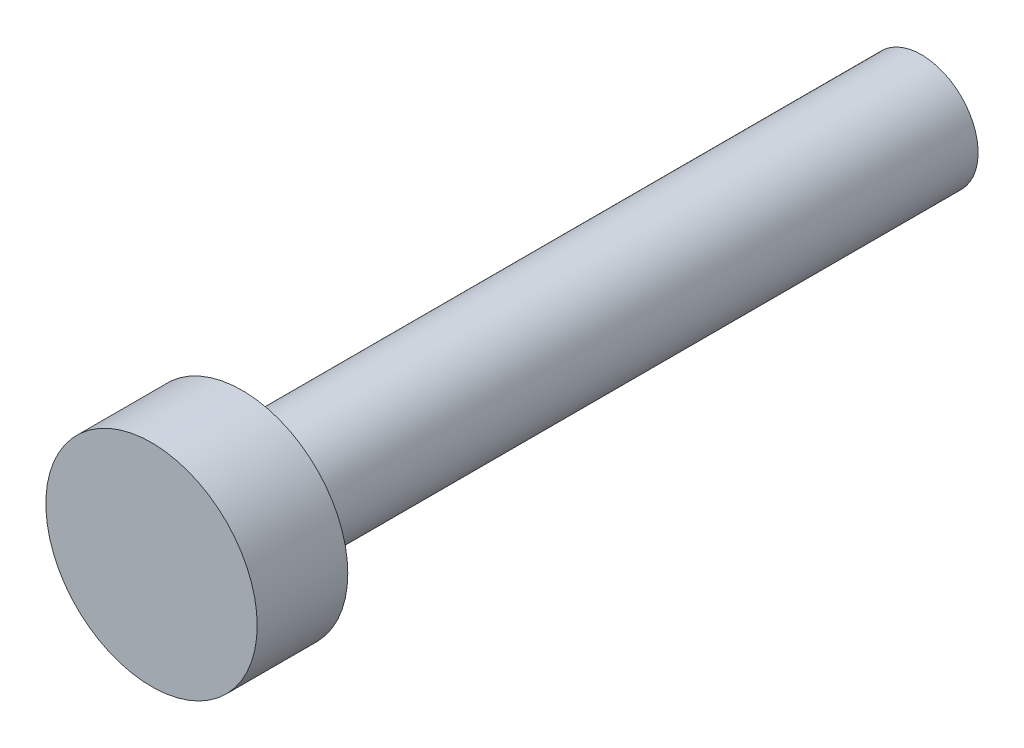
ISO-10303-21;
HEADER;
FILE_DESCRIPTION(('STEP AP214'),'2;1');
FILE_NAME('part.step','',(''),(''),'','','');
FILE_SCHEMA(('AUTOMOTIVE_DESIGN { 1 0 10303 214 1 1 1 1 }'));
ENDSEC;
DATA;
#1=APPLICATION_CONTEXT('core data for automotive mechanical design processes');
#2=APPLICATION_PROTOCOL_DEFINITION('international standard','automotive_design',2000,#1);
#3=PRODUCT_CONTEXT('',#1,'mechanical');
#4=PRODUCT('Part','Part','',(#3));
#5=PRODUCT_RELATED_PRODUCT_CATEGORY('part','',(#4));
#6=PRODUCT_DEFINITION_FORMATION('','',#4);
#7=PRODUCT_DEFINITION_CONTEXT('part definition',#1,'design');
#8=PRODUCT_DEFINITION('design','',#6,#7);
#9=PRODUCT_DEFINITION_SHAPE('','',#8);
#10=(LENGTH_UNIT() NAMED_UNIT(*) SI_UNIT(.MILLI.,.METRE.));
#11=(NAMED_UNIT(*) PLANE_ANGLE_UNIT() SI_UNIT($,.RADIAN.));
#12=(NAMED_UNIT(*) SI_UNIT($,.STERADIAN.) SOLID_ANGLE_UNIT());
#13=UNCERTAINTY_MEASURE_WITH_UNIT(LENGTH_MEASURE(1.E-05),#10,'distance_accuracy_value','');
#14=(GEOMETRIC_REPRESENTATION_CONTEXT(3) GLOBAL_UNCERTAINTY_ASSIGNED_CONTEXT((#13)) GLOBAL_UNIT_ASSIGNED_CONTEXT((#10,
#11,#12)) REPRESENTATION_CONTEXT('',''));
#15=CARTESIAN_POINT('',(0.,0.,0.));
#16=DIRECTION('',(0.,0.,1.));
#17=DIRECTION('',(1.,0.,0.));
#18=AXIS2_PLACEMENT_3D('',#15,#16,#17);
#19=CARTESIAN_POINT('',(0.,0.,2.4));
#20=DIRECTION('',(0.,0.,-1.));
#21=DIRECTION('',(-1.,0.,0.));
#22=AXIS2_PLACEMENT_3D('',#19,#20,#21);
#23=CYLINDRICAL_SURFACE('',#22,2.8);
#24=CARTESIAN_POINT('',(0.,0.,2.4));
#25=DIRECTION('',(0.,0.,1.));
#26=DIRECTION('',(1.,0.,0.));
#27=AXIS2_PLACEMENT_3D('',#24,#25,#26);
#28=CIRCLE('',#27,2.8);
#29=CARTESIAN_POINT('',(2.8,0.,2.4));
#30=VERTEX_POINT('',#29);
#31=EDGE_CURVE('E37',#30,#30,#28,.T.);
#32=ORIENTED_EDGE('',*,*,#31,.F.);
#33=EDGE_LOOP('',(#32));
#34=FACE_BOUND('',#33,.T.);
#35=CARTESIAN_POINT('',(0.,0.,0.));
#36=DIRECTION('',(0.,0.,1.));
#37=DIRECTION('',(1.,0.,0.));
#38=AXIS2_PLACEMENT_3D('',#35,#36,#37);
#39=CIRCLE('',#38,2.8);
#40=CARTESIAN_POINT('',(2.8,0.,0.));
#41=VERTEX_POINT('',#40);
#42=EDGE_CURVE('E33',#41,#41,#39,.T.);
#43=ORIENTED_EDGE('',*,*,#42,.T.);
#44=EDGE_LOOP('',(#43));
#45=FACE_BOUND('',#44,.T.);
#46=ADVANCED_FACE('F30',(#34,#45),#23,.T.);
#47=CARTESIAN_POINT('',(0.,0.,2.4));
#48=DIRECTION('',(0.,0.,1.));
#49=DIRECTION('',(1.,0.,0.));
#50=AXIS2_PLACEMENT_3D('',#47,#48,#49);
#51=PLANE('',#50);
#52=ORIENTED_EDGE('',*,*,#31,.T.);
#53=EDGE_LOOP('',(#52));
#54=FACE_BOUND('',#53,.T.);
#55=ADVANCED_FACE('F54',(#54),#51,.T.);
#56=CARTESIAN_POINT('',(0.,0.,0.));
#57=DIRECTION('',(0.,0.,1.));
#58=DIRECTION('',(1.,0.,0.));
#59=AXIS2_PLACEMENT_3D('',#56,#57,#58);
#60=PLANE('',#59);
#61=CARTESIAN_POINT('',(0.,0.,0.));
#62=DIRECTION('',(0.,0.,-1.));
#63=DIRECTION('',(-1.,0.,0.));
#64=AXIS2_PLACEMENT_3D('',#61,#62,#63);
#65=CIRCLE('',#64,1.5);
#66=CARTESIAN_POINT('',(-1.5,0.,0.));
#67=VERTEX_POINT('',#66);
#68=EDGE_CURVE('E10',#67,#67,#65,.T.);
#69=ORIENTED_EDGE('',*,*,#68,.F.);
#70=EDGE_LOOP('',(#69));
#71=FACE_BOUND('',#70,.T.);
#72=ORIENTED_EDGE('',*,*,#42,.F.);
#73=EDGE_LOOP('',(#72));
#74=FACE_BOUND('',#73,.T.);
#75=ADVANCED_FACE('F51',(#71,#74),#60,.F.);
#76=CARTESIAN_POINT('',(0.,0.,-18.));
#77=DIRECTION('',(0.,0.,1.));
#78=DIRECTION('',(1.,0.,0.));
#79=AXIS2_PLACEMENT_3D('',#76,#77,#78);
#80=CYLINDRICAL_SURFACE('',#79,1.5);
#81=CARTESIAN_POINT('',(0.,0.,-18.));
#82=DIRECTION('',(0.,0.,-1.));
#83=DIRECTION('',(-1.,0.,0.));
#84=AXIS2_PLACEMENT_3D('',#81,#82,#83);
#85=CIRCLE('',#84,1.5);
#86=CARTESIAN_POINT('',(-1.5,0.,-18.));
#87=VERTEX_POINT('',#86);
#88=EDGE_CURVE('E43',#87,#87,#85,.T.);
#89=ORIENTED_EDGE('',*,*,#88,.F.);
#90=EDGE_LOOP('',(#89));
#91=FACE_BOUND('',#90,.T.);
#92=ORIENTED_EDGE('',*,*,#68,.T.);
#93=EDGE_LOOP('',(#92));
#94=FACE_BOUND('',#93,.T.);
#95=ADVANCED_FACE('F53',(#91,#94),#80,.T.);
#96=CARTESIAN_POINT('',(0.,0.,-18.));
#97=DIRECTION('',(0.,0.,-1.));
#98=DIRECTION('',(-1.,0.,0.));
#99=AXIS2_PLACEMENT_3D('',#96,#97,#98);
#100=PLANE('',#99);
#101=ORIENTED_EDGE('',*,*,#88,.T.);
#102=EDGE_LOOP('',(#101));
#103=FACE_BOUND('',#102,.T.);
#104=ADVANCED_FACE('F60',(#103),#100,.T.);
#105=CLOSED_SHELL('',(#46,#55,#75,#95,#104));
#106=MANIFOLD_SOLID_BREP('B2',#105);
#107=ADVANCED_BREP_SHAPE_REPRESENTATION('',(#18,#106),#14);
#108=SHAPE_DEFINITION_REPRESENTATION(#9,#107);
ENDSEC;
END-ISO-10303-21;
